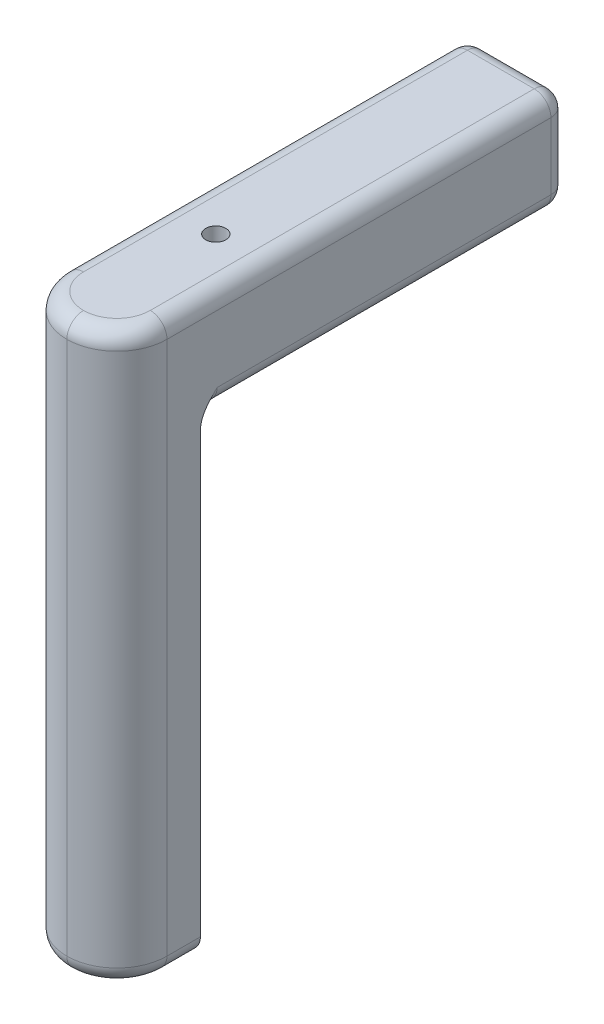
ISO-10303-21;
HEADER;
FILE_DESCRIPTION(('STEP AP214'),'2;1');
FILE_NAME('part.step','',(''),(''),'','','');
FILE_SCHEMA(('AUTOMOTIVE_DESIGN { 1 0 10303 214 1 1 1 1 }'));
ENDSEC;
DATA;
#1=APPLICATION_CONTEXT('core data for automotive mechanical design processes');
#2=APPLICATION_PROTOCOL_DEFINITION('international standard','automotive_design',2000,#1);
#3=PRODUCT_CONTEXT('',#1,'mechanical');
#4=PRODUCT('Part','Part','',(#3));
#5=PRODUCT_RELATED_PRODUCT_CATEGORY('part','',(#4));
#6=PRODUCT_DEFINITION_FORMATION('','',#4);
#7=PRODUCT_DEFINITION_CONTEXT('part definition',#1,'design');
#8=PRODUCT_DEFINITION('design','',#6,#7);
#9=PRODUCT_DEFINITION_SHAPE('','',#8);
#10=(LENGTH_UNIT() NAMED_UNIT(*) SI_UNIT(.MILLI.,.METRE.));
#11=(NAMED_UNIT(*) PLANE_ANGLE_UNIT() SI_UNIT($,.RADIAN.));
#12=(NAMED_UNIT(*) SI_UNIT($,.STERADIAN.) SOLID_ANGLE_UNIT());
#13=UNCERTAINTY_MEASURE_WITH_UNIT(LENGTH_MEASURE(1.E-05),#10,'distance_accuracy_value','');
#14=(GEOMETRIC_REPRESENTATION_CONTEXT(3) GLOBAL_UNCERTAINTY_ASSIGNED_CONTEXT((#13)) GLOBAL_UNIT_ASSIGNED_CONTEXT((#10,
#11,#12)) REPRESENTATION_CONTEXT('',''));
#15=CARTESIAN_POINT('',(0.,0.,0.));
#16=DIRECTION('',(0.,0.,1.));
#17=DIRECTION('',(1.,0.,0.));
#18=AXIS2_PLACEMENT_3D('',#15,#16,#17);
#19=CARTESIAN_POINT('',(30.0000000000001,-330.,240.));
#20=DIRECTION('',(0.,1.,0.));
#21=DIRECTION('',(0.,0.,1.));
#22=AXIS2_PLACEMENT_3D('',#19,#20,#21);
#23=TOROIDAL_SURFACE('',#22,20.,10.);
#24=CARTESIAN_POINT('',(50.0000000000001,-330.,240.));
#25=DIRECTION('',(0.,0.,-1.));
#26=DIRECTION('',(-1.,0.,0.));
#27=AXIS2_PLACEMENT_3D('',#24,#25,#26);
#28=CIRCLE('',#27,10.);
#29=CARTESIAN_POINT('',(60.0000000000001,-330.,240.));
#30=VERTEX_POINT('',#29);
#31=CARTESIAN_POINT('',(50.0000000000001,-340.,240.));
#32=VERTEX_POINT('',#31);
#33=EDGE_CURVE('E11',#30,#32,#28,.T.);
#34=ORIENTED_EDGE('',*,*,#33,.F.);
#35=CARTESIAN_POINT('',(30.0000000000001,-330.,240.));
#36=DIRECTION('',(0.,1.,0.));
#37=DIRECTION('',(0.,0.,1.));
#38=AXIS2_PLACEMENT_3D('',#35,#36,#37);
#39=CIRCLE('',#38,30.);
#40=CARTESIAN_POINT('',(30.0000000000001,-330.,270.));
#41=VERTEX_POINT('',#40);
#42=EDGE_CURVE('E194',#41,#30,#39,.T.);
#43=ORIENTED_EDGE('',*,*,#42,.F.);
#44=CARTESIAN_POINT('',(30.0000000000001,-330.,260.));
#45=DIRECTION('',(1.,0.,0.));
#46=DIRECTION('',(0.,0.,-1.));
#47=AXIS2_PLACEMENT_3D('',#44,#45,#46);
#48=CIRCLE('',#47,10.);
#49=CARTESIAN_POINT('',(30.0000000000001,-340.,260.));
#50=VERTEX_POINT('',#49);
#51=EDGE_CURVE('E43',#41,#50,#48,.T.);
#52=ORIENTED_EDGE('',*,*,#51,.T.);
#53=CARTESIAN_POINT('',(30.0000000000001,-340.,240.));
#54=DIRECTION('',(0.,1.,0.));
#55=DIRECTION('',(0.,0.,1.));
#56=AXIS2_PLACEMENT_3D('',#53,#54,#55);
#57=CIRCLE('',#56,20.);
#58=EDGE_CURVE('E513',#32,#50,#57,.F.);
#59=ORIENTED_EDGE('',*,*,#58,.F.);
#60=EDGE_LOOP('',(#34,#43,#52,#59));
#61=FACE_BOUND('',#60,.T.);
#62=ADVANCED_FACE('F35',(#61),#23,.T.);
#63=CARTESIAN_POINT('',(30.0000000000001,-330.,240.));
#64=DIRECTION('',(0.,1.,0.));
#65=DIRECTION('',(0.,0.,1.));
#66=AXIS2_PLACEMENT_3D('',#63,#64,#65);
#67=TOROIDAL_SURFACE('',#66,20.,10.);
#68=ORIENTED_EDGE('',*,*,#51,.F.);
#69=CARTESIAN_POINT('',(30.0000000000001,-330.,240.));
#70=DIRECTION('',(0.,1.,0.));
#71=DIRECTION('',(0.,0.,1.));
#72=AXIS2_PLACEMENT_3D('',#69,#70,#71);
#73=CIRCLE('',#72,30.);
#74=CARTESIAN_POINT('',(0.,-330.,240.));
#75=VERTEX_POINT('',#74);
#76=EDGE_CURVE('E501',#75,#41,#73,.T.);
#77=ORIENTED_EDGE('',*,*,#76,.F.);
#78=CARTESIAN_POINT('',(10.0000000000001,-330.,240.));
#79=DIRECTION('',(0.,0.,1.));
#80=DIRECTION('',(1.,0.,0.));
#81=AXIS2_PLACEMENT_3D('',#78,#79,#80);
#82=CIRCLE('',#81,10.);
#83=CARTESIAN_POINT('',(10.0000000000001,-340.,240.));
#84=VERTEX_POINT('',#83);
#85=EDGE_CURVE('E511',#75,#84,#82,.T.);
#86=ORIENTED_EDGE('',*,*,#85,.T.);
#87=CARTESIAN_POINT('',(30.0000000000001,-340.,240.));
#88=DIRECTION('',(0.,1.,0.));
#89=DIRECTION('',(0.,0.,1.));
#90=AXIS2_PLACEMENT_3D('',#87,#88,#89);
#91=CIRCLE('',#90,20.);
#92=EDGE_CURVE('E516',#50,#84,#91,.F.);
#93=ORIENTED_EDGE('',*,*,#92,.F.);
#94=EDGE_LOOP('',(#68,#77,#86,#93));
#95=FACE_BOUND('',#94,.T.);
#96=ADVANCED_FACE('F384',(#95),#67,.T.);
#97=CARTESIAN_POINT('',(10.0000000000001,-330.,270.));
#98=DIRECTION('',(0.,0.,1.));
#99=DIRECTION('',(1.,0.,0.));
#100=AXIS2_PLACEMENT_3D('',#97,#98,#99);
#101=CYLINDRICAL_SURFACE('',#100,10.);
#102=ORIENTED_EDGE('',*,*,#85,.F.);
#103=DIRECTION('',(0.,0.,1.));
#104=VECTOR('',#103,1.);
#105=CARTESIAN_POINT('',(0.,-330.,270.));
#106=LINE('',#105,#104);
#107=CARTESIAN_POINT('',(0.,-330.,220.));
#108=VERTEX_POINT('',#107);
#109=EDGE_CURVE('E408',#108,#75,#106,.T.);
#110=ORIENTED_EDGE('',*,*,#109,.F.);
#111=CARTESIAN_POINT('',(10.0000000000001,-330.,220.));
#112=DIRECTION('',(0.,0.,1.));
#113=DIRECTION('',(1.,0.,0.));
#114=AXIS2_PLACEMENT_3D('',#111,#112,#113);
#115=CIRCLE('',#114,10.);
#116=CARTESIAN_POINT('',(10.0000000000001,-340.,220.));
#117=VERTEX_POINT('',#116);
#118=EDGE_CURVE('E503',#117,#108,#115,.F.);
#119=ORIENTED_EDGE('',*,*,#118,.F.);
#120=DIRECTION('',(0.,0.,1.));
#121=VECTOR('',#120,1.);
#122=CARTESIAN_POINT('',(10.0000000000001,-340.,0.));
#123=LINE('',#122,#121);
#124=EDGE_CURVE('E519',#84,#117,#123,.F.);
#125=ORIENTED_EDGE('',*,*,#124,.F.);
#126=EDGE_LOOP('',(#102,#110,#119,#125));
#127=FACE_BOUND('',#126,.T.);
#128=ADVANCED_FACE('F388',(#127),#101,.T.);
#129=CARTESIAN_POINT('',(50.0000000000001,-330.,270.));
#130=DIRECTION('',(0.,0.,-1.));
#131=DIRECTION('',(-1.,0.,0.));
#132=AXIS2_PLACEMENT_3D('',#129,#130,#131);
#133=CYLINDRICAL_SURFACE('',#132,10.);
#134=DIRECTION('',(0.,0.,-1.));
#135=VECTOR('',#134,1.);
#136=CARTESIAN_POINT('',(60.0000000000001,-330.,270.));
#137=LINE('',#136,#135);
#138=CARTESIAN_POINT('',(60.,-330.,220.));
#139=VERTEX_POINT('',#138);
#140=EDGE_CURVE('E478',#30,#139,#137,.T.);
#141=ORIENTED_EDGE('',*,*,#140,.F.);
#142=ORIENTED_EDGE('',*,*,#33,.T.);
#143=DIRECTION('',(0.,0.,-1.));
#144=VECTOR('',#143,1.);
#145=CARTESIAN_POINT('',(50.0000000000001,-340.,0.));
#146=LINE('',#145,#144);
#147=CARTESIAN_POINT('',(50.0000000000001,-340.,220.));
#148=VERTEX_POINT('',#147);
#149=EDGE_CURVE('E522',#148,#32,#146,.F.);
#150=ORIENTED_EDGE('',*,*,#149,.F.);
#151=CARTESIAN_POINT('',(50.0000000000001,-330.,220.));
#152=DIRECTION('',(0.,0.,1.));
#153=DIRECTION('',(1.,0.,0.));
#154=AXIS2_PLACEMENT_3D('',#151,#152,#153);
#155=CIRCLE('',#154,10.);
#156=EDGE_CURVE('E506',#139,#148,#155,.F.);
#157=ORIENTED_EDGE('',*,*,#156,.F.);
#158=EDGE_LOOP('',(#141,#142,#150,#157));
#159=FACE_BOUND('',#158,.T.);
#160=ADVANCED_FACE('F37',(#159),#133,.T.);
#161=CARTESIAN_POINT('',(60.,-70.,210.));
#162=DIRECTION('',(-1.,0.,0.));
#163=DIRECTION('',(0.,-1.,0.));
#164=AXIS2_PLACEMENT_3D('',#161,#162,#163);
#165=CYLINDRICAL_SURFACE('',#164,10.);
#166=CARTESIAN_POINT('',(50.,-70.,210.));
#167=DIRECTION('',(-1.,0.,0.));
#168=DIRECTION('',(0.,0.,1.));
#169=AXIS2_PLACEMENT_3D('',#166,#167,#168);
#170=CIRCLE('',#169,10.);
#171=CARTESIAN_POINT('',(50.,-70.,220.));
#172=VERTEX_POINT('',#171);
#173=CARTESIAN_POINT('',(50.,-60.,210.));
#174=VERTEX_POINT('',#173);
#175=EDGE_CURVE('E409',#172,#174,#170,.T.);
#176=ORIENTED_EDGE('',*,*,#175,.F.);
#177=DIRECTION('',(1.,0.,0.));
#178=VECTOR('',#177,1.);
#179=CARTESIAN_POINT('',(60.,-70.,220.));
#180=LINE('',#179,#178);
#181=CARTESIAN_POINT('',(10.,-70.,220.));
#182=VERTEX_POINT('',#181);
#183=EDGE_CURVE('E286',#182,#172,#180,.T.);
#184=ORIENTED_EDGE('',*,*,#183,.F.);
#185=CARTESIAN_POINT('',(10.,-70.,210.));
#186=DIRECTION('',(-1.,0.,0.));
#187=DIRECTION('',(0.,-1.,0.));
#188=AXIS2_PLACEMENT_3D('',#185,#186,#187);
#189=CIRCLE('',#188,10.);
#190=CARTESIAN_POINT('',(10.,-60.,210.));
#191=VERTEX_POINT('',#190);
#192=EDGE_CURVE('E309',#182,#191,#189,.T.);
#193=ORIENTED_EDGE('',*,*,#192,.T.);
#194=DIRECTION('',(1.,0.,0.));
#195=VECTOR('',#194,1.);
#196=CARTESIAN_POINT('',(60.,-60.,210.));
#197=LINE('',#196,#195);
#198=EDGE_CURVE('E295',#174,#191,#197,.F.);
#199=ORIENTED_EDGE('',*,*,#198,.F.);
#200=EDGE_LOOP('',(#176,#184,#193,#199));
#201=FACE_BOUND('',#200,.T.);
#202=ADVANCED_FACE('F394',(#201),#165,.F.);
#203=CARTESIAN_POINT('',(10.,-50.,210.));
#204=DIRECTION('',(0.,0.,1.));
#205=DIRECTION('',(1.,0.,0.));
#206=AXIS2_PLACEMENT_3D('',#203,#204,#205);
#207=TOROIDAL_SURFACE('',#206,20.,10.);
#208=ORIENTED_EDGE('',*,*,#192,.F.);
#209=CARTESIAN_POINT('',(10.,-50.,220.));
#210=DIRECTION('',(0.,0.,1.));
#211=DIRECTION('',(1.,0.,0.));
#212=AXIS2_PLACEMENT_3D('',#209,#210,#211);
#213=CIRCLE('',#212,20.);
#214=CARTESIAN_POINT('',(0.,-67.3205080756888,220.));
#215=VERTEX_POINT('',#214);
#216=EDGE_CURVE('E289',#215,#182,#213,.T.);
#217=ORIENTED_EDGE('',*,*,#216,.F.);
#218=CARTESIAN_POINT('',(0.,-67.3205080756888,220.));
#219=CARTESIAN_POINT('',(0.,-67.1062907853983,220.000000829417));
#220=CARTESIAN_POINT('',(0.,-66.8921147964453,219.994836871748));
#221=CARTESIAN_POINT('',(0.,-66.4642751543601,219.974491501273));
#222=CARTESIAN_POINT('',(0.,-66.2506114166656,219.959311875246));
#223=CARTESIAN_POINT('',(0.,-65.6116455019268,219.899282982085));
#224=CARTESIAN_POINT('',(0.,-65.1876354946503,219.839941524498));
#225=CARTESIAN_POINT('',(0.,-64.3514038896006,219.686351182212));
#226=CARTESIAN_POINT('',(0.,-63.9391018127161,219.592531458086));
#227=CARTESIAN_POINT('',(0.,-63.1229969058086,219.372806541135));
#228=CARTESIAN_POINT('',(0.,-62.7191982356669,219.246886021966));
#229=CARTESIAN_POINT('',(0.,-61.7735269645086,218.913718731248));
#230=CARTESIAN_POINT('',(0.,-61.2361612650731,218.69364330392));
#231=CARTESIAN_POINT('',(0.,-60.1831990768957,218.206627544239));
#232=CARTESIAN_POINT('',(0.,-59.6676092455983,217.939673006562));
#233=CARTESIAN_POINT('',(0.,-58.6564886785677,217.365152113458));
#234=CARTESIAN_POINT('',(0.,-58.1610654952248,217.057397901332));
#235=CARTESIAN_POINT('',(0.,-57.1918276771039,216.409375692374));
#236=CARTESIAN_POINT('',(0.,-56.7180230662366,216.069092834784));
#237=CARTESIAN_POINT('',(0.,-55.6929197676459,215.288802211421));
#238=CARTESIAN_POINT('',(0.,-55.1461840200336,214.842838078763));
#239=CARTESIAN_POINT('',(0.,-54.0758369196157,213.92383304621));
#240=CARTESIAN_POINT('',(0.,-53.5522359254217,213.450780230682));
#241=CARTESIAN_POINT('',(0.,-52.0073282129812,212.00699997596));
#242=CARTESIAN_POINT('',(0.,-51.0104804173162,211.010478873278));
#243=CARTESIAN_POINT('',(0.,-50.0094280824946,210.009428082719));
#244=CARTESIAN_POINT('',(0.,-50.0047140372459,210.004714037463));
#245=CARTESIAN_POINT('',(0.,-50.,210.));
#246=B_SPLINE_CURVE_WITH_KNOTS('',3,(#218,#219,#220,#221,#222,#223,#224,#225,#226,#227,#228,
#229,#230,#231,#232,#233,#234,#235,#236,#237,#238,#239,#240,#241,#242,#243,#244,#245),
.UNSPECIFIED.,.F.,.F.,(4,2,2,2,2,2,2,2,2,2,2,2,2,4),(0.,0.642515246720243,1.28491590083639,
2.56752628259208,3.83468440193273,5.10244865556355,6.84175192857022,8.58158315814063,
10.329723087327,12.0786655086561,14.1940481607873,16.3103685733023,20.5374636264517,
20.557463626454),.UNSPECIFIED.);
#247=CARTESIAN_POINT('',(0.,-50.,210.));
#248=VERTEX_POINT('',#247);
#249=EDGE_CURVE('E301',#215,#248,#246,.T.);
#250=ORIENTED_EDGE('',*,*,#249,.T.);
#251=CARTESIAN_POINT('',(10.,-50.,210.));
#252=DIRECTION('',(0.,0.,1.));
#253=DIRECTION('',(1.,0.,0.));
#254=AXIS2_PLACEMENT_3D('',#251,#252,#253);
#255=CIRCLE('',#254,10.);
#256=EDGE_CURVE('E292',#191,#248,#255,.F.);
#257=ORIENTED_EDGE('',*,*,#256,.F.);
#258=EDGE_LOOP('',(#208,#217,#250,#257));
#259=FACE_BOUND('',#258,.T.);
#260=ADVANCED_FACE('F311',(#259),#207,.F.);
#261=CARTESIAN_POINT('',(50.,-50.,210.));
#262=DIRECTION('',(0.,0.,1.));
#263=DIRECTION('',(1.,0.,0.));
#264=AXIS2_PLACEMENT_3D('',#261,#262,#263);
#265=TOROIDAL_SURFACE('',#264,20.,10.);
#266=CARTESIAN_POINT('',(50.,-50.,220.));
#267=DIRECTION('',(0.,0.,1.));
#268=DIRECTION('',(1.,0.,0.));
#269=AXIS2_PLACEMENT_3D('',#266,#267,#268);
#270=CIRCLE('',#269,20.);
#271=CARTESIAN_POINT('',(60.,-67.3205080756888,220.));
#272=VERTEX_POINT('',#271);
#273=EDGE_CURVE('E283',#172,#272,#270,.T.);
#274=ORIENTED_EDGE('',*,*,#273,.F.);
#275=ORIENTED_EDGE('',*,*,#175,.T.);
#276=CARTESIAN_POINT('',(50.,-50.,210.));
#277=DIRECTION('',(0.,0.,1.));
#278=DIRECTION('',(1.,0.,0.));
#279=AXIS2_PLACEMENT_3D('',#276,#277,#278);
#280=CIRCLE('',#279,10.);
#281=CARTESIAN_POINT('',(60.,-50.,210.));
#282=VERTEX_POINT('',#281);
#283=EDGE_CURVE('E298',#282,#174,#280,.F.);
#284=ORIENTED_EDGE('',*,*,#283,.F.);
#285=CARTESIAN_POINT('',(60.,-67.3205080756888,220.));
#286=CARTESIAN_POINT('',(60.,-67.1062907853998,220.000000829417));
#287=CARTESIAN_POINT('',(60.,-66.8921147964481,219.994836871748));
#288=CARTESIAN_POINT('',(60.,-66.4642751543657,219.974491501273));
#289=CARTESIAN_POINT('',(60.,-66.2506114166725,219.959311875247));
#290=CARTESIAN_POINT('',(60.,-65.6116455019379,219.899282982087));
#291=CARTESIAN_POINT('',(60.,-65.1876354946642,219.8399415245));
#292=CARTESIAN_POINT('',(60.,-64.3514038896144,219.686351182215));
#293=CARTESIAN_POINT('',(60.,-63.9391018127272,219.592531458089));
#294=CARTESIAN_POINT('',(60.,-63.1229969058141,219.372806541136));
#295=CARTESIAN_POINT('',(60.,-62.7191982356696,219.246886021966));
#296=CARTESIAN_POINT('',(60.,-61.7735269645064,218.913718731247));
#297=CARTESIAN_POINT('',(60.,-61.2361612650687,218.693643303918));
#298=CARTESIAN_POINT('',(60.,-60.1831990768874,218.206627544235));
#299=CARTESIAN_POINT('',(60.,-59.6676092455883,217.939673006557));
#300=CARTESIAN_POINT('',(60.,-58.6564886785586,217.365152113452));
#301=CARTESIAN_POINT('',(60.,-58.1610654952181,217.057397901328));
#302=CARTESIAN_POINT('',(60.,-57.1918276771007,216.409375692372));
#303=CARTESIAN_POINT('',(60.,-56.7180230662344,216.069092834784));
#304=CARTESIAN_POINT('',(60.,-55.6929197676474,215.288802211421));
#305=CARTESIAN_POINT('',(60.,-55.1461840200384,214.84283807876));
#306=CARTESIAN_POINT('',(60.,-54.0758369196146,213.923833046217));
#307=CARTESIAN_POINT('',(60.,-53.5522359254112,213.450780230701));
#308=CARTESIAN_POINT('',(60.,-52.0073282130139,212.006999975934));
#309=CARTESIAN_POINT('',(60.,-51.0104804174776,211.01047887312));
#310=CARTESIAN_POINT('',(60.,-50.0094280824961,210.009428082717));
#311=CARTESIAN_POINT('',(60.,-50.0047140372466,210.004714037462));
#312=CARTESIAN_POINT('',(60.,-50.,210.));
#313=B_SPLINE_CURVE_WITH_KNOTS('',3,(#285,#286,#287,#288,#289,#290,#291,#292,#293,#294,#295,
#296,#297,#298,#299,#300,#301,#302,#303,#304,#305,#306,#307,#308,#309,#310,#311,#312),
.UNSPECIFIED.,.F.,.F.,(4,2,2,2,2,2,2,2,2,2,2,2,2,4),(0.,0.64251524671609,1.28491590082808,
2.56752628257515,3.83468440192409,5.10244865556354,6.8417519285774,8.58158315815393,
10.3297230873326,12.0786655086561,14.1940481607855,16.310368573295,20.5374636264518,
20.557463626454),.UNSPECIFIED.);
#314=EDGE_CURVE('E401',#282,#272,#313,.F.);
#315=ORIENTED_EDGE('',*,*,#314,.T.);
#316=EDGE_LOOP('',(#274,#275,#284,#315));
#317=FACE_BOUND('',#316,.T.);
#318=ADVANCED_FACE('F376',(#317),#265,.F.);
#319=CARTESIAN_POINT('',(10.,-50.,10.));
#320=DIRECTION('',(0.,1.,0.));
#321=DIRECTION('',(-1.,0.,0.));
#322=AXIS2_PLACEMENT_3D('',#319,#320,#321);
#323=SPHERICAL_SURFACE('',#322,10.);
#324=CARTESIAN_POINT('',(10.,-50.,10.));
#325=DIRECTION('',(0.,0.,1.));
#326=DIRECTION('',(1.,0.,0.));
#327=AXIS2_PLACEMENT_3D('',#324,#325,#326);
#328=CIRCLE('',#327,10.);
#329=CARTESIAN_POINT('',(0.,-50.,10.));
#330=VERTEX_POINT('',#329);
#331=CARTESIAN_POINT('',(10.,-60.,10.));
#332=VERTEX_POINT('',#331);
#333=EDGE_CURVE('E280',#330,#332,#328,.T.);
#334=ORIENTED_EDGE('',*,*,#333,.F.);
#335=CARTESIAN_POINT('',(10.,-50.,10.));
#336=DIRECTION('',(0.,1.,0.));
#337=DIRECTION('',(-1.,0.,0.));
#338=AXIS2_PLACEMENT_3D('',#335,#336,#337);
#339=CIRCLE('',#338,10.);
#340=CARTESIAN_POINT('',(10.,-50.,0.));
#341=VERTEX_POINT('',#340);
#342=EDGE_CURVE('E266',#341,#330,#339,.T.);
#343=ORIENTED_EDGE('',*,*,#342,.F.);
#344=CARTESIAN_POINT('',(10.,-50.,10.));
#345=DIRECTION('',(-1.,0.,0.));
#346=DIRECTION('',(0.,-1.,0.));
#347=AXIS2_PLACEMENT_3D('',#344,#345,#346);
#348=CIRCLE('',#347,10.);
#349=EDGE_CURVE('E277',#341,#332,#348,.T.);
#350=ORIENTED_EDGE('',*,*,#349,.T.);
#351=EDGE_LOOP('',(#334,#343,#350));
#352=FACE_BOUND('',#351,.T.);
#353=ADVANCED_FACE('F373',(#352),#323,.T.);
#354=CARTESIAN_POINT('',(0.,-50.,10.));
#355=DIRECTION('',(1.,0.,0.));
#356=DIRECTION('',(0.,1.,0.));
#357=AXIS2_PLACEMENT_3D('',#354,#355,#356);
#358=CYLINDRICAL_SURFACE('',#357,10.);
#359=ORIENTED_EDGE('',*,*,#349,.F.);
#360=DIRECTION('',(-1.,0.,0.));
#361=VECTOR('',#360,1.);
#362=CARTESIAN_POINT('',(0.,-50.,0.));
#363=LINE('',#362,#361);
#364=CARTESIAN_POINT('',(50.,-50.,0.));
#365=VERTEX_POINT('',#364);
#366=EDGE_CURVE('E263',#365,#341,#363,.T.);
#367=ORIENTED_EDGE('',*,*,#366,.F.);
#368=CARTESIAN_POINT('',(50.,-50.,10.));
#369=DIRECTION('',(-1.,0.,0.));
#370=DIRECTION('',(0.,0.,1.));
#371=AXIS2_PLACEMENT_3D('',#368,#369,#370);
#372=CIRCLE('',#371,10.);
#373=CARTESIAN_POINT('',(50.,-60.,10.));
#374=VERTEX_POINT('',#373);
#375=EDGE_CURVE('E275',#365,#374,#372,.T.);
#376=ORIENTED_EDGE('',*,*,#375,.T.);
#377=DIRECTION('',(-1.,0.,0.));
#378=VECTOR('',#377,1.);
#379=CARTESIAN_POINT('',(0.,-60.,10.));
#380=LINE('',#379,#378);
#381=EDGE_CURVE('E254',#332,#374,#380,.F.);
#382=ORIENTED_EDGE('',*,*,#381,.F.);
#383=EDGE_LOOP('',(#359,#367,#376,#382));
#384=FACE_BOUND('',#383,.T.);
#385=ADVANCED_FACE('F369',(#384),#358,.T.);
#386=CARTESIAN_POINT('',(50.,-50.,10.));
#387=DIRECTION('',(0.,1.,0.));
#388=DIRECTION('',(-1.,0.,0.));
#389=AXIS2_PLACEMENT_3D('',#386,#387,#388);
#390=SPHERICAL_SURFACE('',#389,10.);
#391=ORIENTED_EDGE('',*,*,#375,.F.);
#392=CARTESIAN_POINT('',(50.,-50.,10.));
#393=DIRECTION('',(0.,-1.,0.));
#394=DIRECTION('',(1.,0.,0.));
#395=AXIS2_PLACEMENT_3D('',#392,#393,#394);
#396=CIRCLE('',#395,10.);
#397=CARTESIAN_POINT('',(60.,-50.,10.));
#398=VERTEX_POINT('',#397);
#399=EDGE_CURVE('E260',#398,#365,#396,.F.);
#400=ORIENTED_EDGE('',*,*,#399,.F.);
#401=CARTESIAN_POINT('',(50.,-50.,10.));
#402=DIRECTION('',(0.,0.,-1.));
#403=DIRECTION('',(-1.,0.,0.));
#404=AXIS2_PLACEMENT_3D('',#401,#402,#403);
#405=CIRCLE('',#404,10.);
#406=EDGE_CURVE('E272',#398,#374,#405,.T.);
#407=ORIENTED_EDGE('',*,*,#406,.T.);
#408=EDGE_LOOP('',(#391,#400,#407));
#409=FACE_BOUND('',#408,.T.);
#410=ADVANCED_FACE('F365',(#409),#390,.T.);
#411=CARTESIAN_POINT('',(50.,-50.,270.));
#412=DIRECTION('',(0.,0.,-1.));
#413=DIRECTION('',(-1.,0.,0.));
#414=AXIS2_PLACEMENT_3D('',#411,#412,#413);
#415=CYLINDRICAL_SURFACE('',#414,10.);
#416=DIRECTION('',(0.,0.,-1.));
#417=VECTOR('',#416,1.);
#418=CARTESIAN_POINT('',(60.,-50.,270.));
#419=LINE('',#418,#417);
#420=EDGE_CURVE('E250',#282,#398,#419,.T.);
#421=ORIENTED_EDGE('',*,*,#420,.F.);
#422=ORIENTED_EDGE('',*,*,#283,.T.);
#423=DIRECTION('',(0.,0.,-1.));
#424=VECTOR('',#423,1.);
#425=CARTESIAN_POINT('',(50.,-60.,270.));
#426=LINE('',#425,#424);
#427=EDGE_CURVE('E257',#374,#174,#426,.F.);
#428=ORIENTED_EDGE('',*,*,#427,.F.);
#429=ORIENTED_EDGE('',*,*,#406,.F.);
#430=EDGE_LOOP('',(#421,#422,#428,#429));
#431=FACE_BOUND('',#430,.T.);
#432=ADVANCED_FACE('F362',(#431),#415,.T.);
#433=CARTESIAN_POINT('',(10.,-50.,270.));
#434=DIRECTION('',(0.,0.,1.));
#435=DIRECTION('',(1.,0.,0.));
#436=AXIS2_PLACEMENT_3D('',#433,#434,#435);
#437=CYLINDRICAL_SURFACE('',#436,10.);
#438=DIRECTION('',(0.,0.,1.));
#439=VECTOR('',#438,1.);
#440=CARTESIAN_POINT('',(10.,-60.,270.));
#441=LINE('',#440,#439);
#442=EDGE_CURVE('E252',#191,#332,#441,.F.);
#443=ORIENTED_EDGE('',*,*,#442,.F.);
#444=ORIENTED_EDGE('',*,*,#256,.T.);
#445=DIRECTION('',(0.,0.,1.));
#446=VECTOR('',#445,1.);
#447=CARTESIAN_POINT('',(0.,-50.,270.));
#448=LINE('',#447,#446);
#449=EDGE_CURVE('E269',#330,#248,#448,.T.);
#450=ORIENTED_EDGE('',*,*,#449,.F.);
#451=ORIENTED_EDGE('',*,*,#333,.T.);
#452=EDGE_LOOP('',(#443,#444,#450,#451));
#453=FACE_BOUND('',#452,.T.);
#454=ADVANCED_FACE('F357',(#453),#437,.T.);
#455=CARTESIAN_POINT('',(10.,-9.99999999999999,10.));
#456=DIRECTION('',(0.,0.,-1.));
#457=DIRECTION('',(-1.,0.,0.));
#458=AXIS2_PLACEMENT_3D('',#455,#456,#457);
#459=SPHERICAL_SURFACE('',#458,10.);
#460=CARTESIAN_POINT('',(10.,-9.99999999999999,9.99999999999995));
#461=DIRECTION('',(0.,-1.,0.));
#462=DIRECTION('',(0.,0.,-1.));
#463=AXIS2_PLACEMENT_3D('',#460,#461,#462);
#464=CIRCLE('',#463,10.);
#465=CARTESIAN_POINT('',(0.,-9.99999999999999,9.99999999999995));
#466=VERTEX_POINT('',#465);
#467=CARTESIAN_POINT('',(10.,-9.99999999999999,0.));
#468=VERTEX_POINT('',#467);
#469=EDGE_CURVE('E247',#466,#468,#464,.T.);
#470=ORIENTED_EDGE('',*,*,#469,.F.);
#471=CARTESIAN_POINT('',(10.,-9.99999999999999,10.));
#472=DIRECTION('',(0.,0.,-1.));
#473=DIRECTION('',(-1.,0.,0.));
#474=AXIS2_PLACEMENT_3D('',#471,#472,#473);
#475=CIRCLE('',#474,10.);
#476=CARTESIAN_POINT('',(10.,0.,9.99999999999995));
#477=VERTEX_POINT('',#476);
#478=EDGE_CURVE('E233',#477,#466,#475,.F.);
#479=ORIENTED_EDGE('',*,*,#478,.F.);
#480=CARTESIAN_POINT('',(10.,-10.,9.99999999999995));
#481=DIRECTION('',(-1.,0.,0.));
#482=DIRECTION('',(0.,0.,1.));
#483=AXIS2_PLACEMENT_3D('',#480,#481,#482);
#484=CIRCLE('',#483,10.);
#485=EDGE_CURVE('E244',#477,#468,#484,.T.);
#486=ORIENTED_EDGE('',*,*,#485,.T.);
#487=EDGE_LOOP('',(#470,#479,#486));
#488=FACE_BOUND('',#487,.T.);
#489=ADVANCED_FACE('F353',(#488),#459,.T.);
#490=CARTESIAN_POINT('',(0.,-10.,10.));
#491=DIRECTION('',(1.,0.,0.));
#492=DIRECTION('',(0.,0.,-1.));
#493=AXIS2_PLACEMENT_3D('',#490,#491,#492);
#494=CYLINDRICAL_SURFACE('',#493,10.);
#495=ORIENTED_EDGE('',*,*,#485,.F.);
#496=DIRECTION('',(-1.,0.,0.));
#497=VECTOR('',#496,1.);
#498=CARTESIAN_POINT('',(0.,0.,10.));
#499=LINE('',#498,#497);
#500=CARTESIAN_POINT('',(50.,0.,10.));
#501=VERTEX_POINT('',#500);
#502=EDGE_CURVE('E230',#501,#477,#499,.T.);
#503=ORIENTED_EDGE('',*,*,#502,.F.);
#504=CARTESIAN_POINT('',(50.,-10.,10.));
#505=DIRECTION('',(-1.,0.,0.));
#506=DIRECTION('',(0.,0.,1.));
#507=AXIS2_PLACEMENT_3D('',#504,#505,#506);
#508=CIRCLE('',#507,10.);
#509=CARTESIAN_POINT('',(50.,-10.,0.));
#510=VERTEX_POINT('',#509);
#511=EDGE_CURVE('E242',#501,#510,#508,.T.);
#512=ORIENTED_EDGE('',*,*,#511,.T.);
#513=DIRECTION('',(-1.,0.,0.));
#514=VECTOR('',#513,1.);
#515=CARTESIAN_POINT('',(0.,-10.,0.));
#516=LINE('',#515,#514);
#517=EDGE_CURVE('E222',#468,#510,#516,.F.);
#518=ORIENTED_EDGE('',*,*,#517,.F.);
#519=EDGE_LOOP('',(#495,#503,#512,#518));
#520=FACE_BOUND('',#519,.T.);
#521=ADVANCED_FACE('F349',(#520),#494,.T.);
#522=CARTESIAN_POINT('',(50.,-10.,10.));
#523=DIRECTION('',(0.,0.,-1.));
#524=DIRECTION('',(-1.,0.,0.));
#525=AXIS2_PLACEMENT_3D('',#522,#523,#524);
#526=SPHERICAL_SURFACE('',#525,10.);
#527=ORIENTED_EDGE('',*,*,#511,.F.);
#528=CARTESIAN_POINT('',(50.,-10.,10.));
#529=DIRECTION('',(0.,0.,1.));
#530=DIRECTION('',(1.,0.,0.));
#531=AXIS2_PLACEMENT_3D('',#528,#529,#530);
#532=CIRCLE('',#531,10.);
#533=CARTESIAN_POINT('',(60.,-9.99999999999999,10.));
#534=VERTEX_POINT('',#533);
#535=EDGE_CURVE('E228',#534,#501,#532,.T.);
#536=ORIENTED_EDGE('',*,*,#535,.F.);
#537=CARTESIAN_POINT('',(50.,-10.,10.));
#538=DIRECTION('',(0.,1.,0.));
#539=DIRECTION('',(-1.,0.,0.));
#540=AXIS2_PLACEMENT_3D('',#537,#538,#539);
#541=CIRCLE('',#540,10.);
#542=EDGE_CURVE('E239',#534,#510,#541,.T.);
#543=ORIENTED_EDGE('',*,*,#542,.T.);
#544=EDGE_LOOP('',(#527,#536,#543));
#545=FACE_BOUND('',#544,.T.);
#546=ADVANCED_FACE('F345',(#545),#526,.T.);
#547=CARTESIAN_POINT('',(50.,0.,10.));
#548=DIRECTION('',(0.,-1.,0.));
#549=DIRECTION('',(1.,0.,0.));
#550=AXIS2_PLACEMENT_3D('',#547,#548,#549);
#551=CYLINDRICAL_SURFACE('',#550,10.);
#552=DIRECTION('',(0.,1.,0.));
#553=VECTOR('',#552,1.);
#554=CARTESIAN_POINT('',(60.,0.,10.));
#555=LINE('',#554,#553);
#556=EDGE_CURVE('E164',#398,#534,#555,.T.);
#557=ORIENTED_EDGE('',*,*,#556,.F.);
#558=ORIENTED_EDGE('',*,*,#399,.T.);
#559=DIRECTION('',(0.,1.,0.));
#560=VECTOR('',#559,1.);
#561=CARTESIAN_POINT('',(50.,0.,0.));
#562=LINE('',#561,#560);
#563=EDGE_CURVE('E225',#510,#365,#562,.F.);
#564=ORIENTED_EDGE('',*,*,#563,.F.);
#565=ORIENTED_EDGE('',*,*,#542,.F.);
#566=EDGE_LOOP('',(#557,#558,#564,#565));
#567=FACE_BOUND('',#566,.T.);
#568=ADVANCED_FACE('F342',(#567),#551,.T.);
#569=CARTESIAN_POINT('',(10.,-60.,10.));
#570=DIRECTION('',(0.,1.,0.));
#571=DIRECTION('',(-1.,0.,0.));
#572=AXIS2_PLACEMENT_3D('',#569,#570,#571);
#573=CYLINDRICAL_SURFACE('',#572,10.);
#574=DIRECTION('',(0.,-1.,0.));
#575=VECTOR('',#574,1.);
#576=CARTESIAN_POINT('',(10.,-60.,0.));
#577=LINE('',#576,#575);
#578=EDGE_CURVE('E220',#341,#468,#577,.F.);
#579=ORIENTED_EDGE('',*,*,#578,.F.);
#580=ORIENTED_EDGE('',*,*,#342,.T.);
#581=DIRECTION('',(0.,-1.,0.));
#582=VECTOR('',#581,1.);
#583=CARTESIAN_POINT('',(0.,-60.,10.));
#584=LINE('',#583,#582);
#585=EDGE_CURVE('E236',#466,#330,#584,.T.);
#586=ORIENTED_EDGE('',*,*,#585,.F.);
#587=ORIENTED_EDGE('',*,*,#469,.T.);
#588=EDGE_LOOP('',(#579,#580,#586,#587));
#589=FACE_BOUND('',#588,.T.);
#590=ADVANCED_FACE('F337',(#589),#573,.T.);
#591=CARTESIAN_POINT('',(30.,-10.,240.));
#592=DIRECTION('',(0.,-1.,0.));
#593=DIRECTION('',(0.,0.,-1.));
#594=AXIS2_PLACEMENT_3D('',#591,#592,#593);
#595=TOROIDAL_SURFACE('',#594,20.,10.);
#596=CARTESIAN_POINT('',(10.,-10.,240.));
#597=DIRECTION('',(0.,0.,-1.));
#598=DIRECTION('',(-1.,0.,0.));
#599=AXIS2_PLACEMENT_3D('',#596,#597,#598);
#600=CIRCLE('',#599,10.);
#601=CARTESIAN_POINT('',(0.,-10.,240.));
#602=VERTEX_POINT('',#601);
#603=CARTESIAN_POINT('',(10.,0.,240.));
#604=VERTEX_POINT('',#603);
#605=EDGE_CURVE('E216',#602,#604,#600,.T.);
#606=ORIENTED_EDGE('',*,*,#605,.F.);
#607=CARTESIAN_POINT('',(30.,-10.,240.));
#608=DIRECTION('',(0.,-1.,0.));
#609=DIRECTION('',(0.,0.,-1.));
#610=AXIS2_PLACEMENT_3D('',#607,#608,#609);
#611=CIRCLE('',#610,30.);
#612=CARTESIAN_POINT('',(30.,-10.,270.));
#613=VERTEX_POINT('',#612);
#614=EDGE_CURVE('E190',#613,#602,#611,.T.);
#615=ORIENTED_EDGE('',*,*,#614,.F.);
#616=CARTESIAN_POINT('',(30.,-10.,260.));
#617=DIRECTION('',(-1.,0.,0.));
#618=DIRECTION('',(0.,0.,1.));
#619=AXIS2_PLACEMENT_3D('',#616,#617,#618);
#620=CIRCLE('',#619,10.);
#621=CARTESIAN_POINT('',(30.,0.,260.));
#622=VERTEX_POINT('',#621);
#623=EDGE_CURVE('E180',#613,#622,#620,.T.);
#624=ORIENTED_EDGE('',*,*,#623,.T.);
#625=CARTESIAN_POINT('',(30.,0.,240.));
#626=DIRECTION('',(0.,-1.,0.));
#627=DIRECTION('',(0.,0.,-1.));
#628=AXIS2_PLACEMENT_3D('',#625,#626,#627);
#629=CIRCLE('',#628,20.);
#630=EDGE_CURVE('E205',#604,#622,#629,.F.);
#631=ORIENTED_EDGE('',*,*,#630,.F.);
#632=EDGE_LOOP('',(#606,#615,#624,#631));
#633=FACE_BOUND('',#632,.T.);
#634=ADVANCED_FACE('F334',(#633),#595,.T.);
#635=CARTESIAN_POINT('',(30.,-10.,240.));
#636=DIRECTION('',(0.,-1.,0.));
#637=DIRECTION('',(0.,0.,-1.));
#638=AXIS2_PLACEMENT_3D('',#635,#636,#637);
#639=TOROIDAL_SURFACE('',#638,20.,10.);
#640=ORIENTED_EDGE('',*,*,#623,.F.);
#641=CARTESIAN_POINT('',(30.,-10.,240.));
#642=DIRECTION('',(0.,-1.,0.));
#643=DIRECTION('',(0.,0.,-1.));
#644=AXIS2_PLACEMENT_3D('',#641,#642,#643);
#645=CIRCLE('',#644,30.);
#646=CARTESIAN_POINT('',(60.,-9.99999999999999,240.));
#647=VERTEX_POINT('',#646);
#648=EDGE_CURVE('E185',#647,#613,#645,.T.);
#649=ORIENTED_EDGE('',*,*,#648,.F.);
#650=CARTESIAN_POINT('',(50.,-10.,240.));
#651=DIRECTION('',(0.,0.,1.));
#652=DIRECTION('',(1.,0.,0.));
#653=AXIS2_PLACEMENT_3D('',#650,#651,#652);
#654=CIRCLE('',#653,10.);
#655=CARTESIAN_POINT('',(50.,0.,240.));
#656=VERTEX_POINT('',#655);
#657=EDGE_CURVE('E172',#647,#656,#654,.T.);
#658=ORIENTED_EDGE('',*,*,#657,.T.);
#659=CARTESIAN_POINT('',(30.,0.,240.));
#660=DIRECTION('',(0.,-1.,0.));
#661=DIRECTION('',(0.,0.,-1.));
#662=AXIS2_PLACEMENT_3D('',#659,#660,#661);
#663=CIRCLE('',#662,20.);
#664=EDGE_CURVE('E208',#622,#656,#663,.F.);
#665=ORIENTED_EDGE('',*,*,#664,.F.);
#666=EDGE_LOOP('',(#640,#649,#658,#665));
#667=FACE_BOUND('',#666,.T.);
#668=ADVANCED_FACE('F186',(#667),#639,.T.);
#669=CARTESIAN_POINT('',(50.,-10.,270.));
#670=DIRECTION('',(0.,0.,1.));
#671=DIRECTION('',(1.,0.,0.));
#672=AXIS2_PLACEMENT_3D('',#669,#670,#671);
#673=CYLINDRICAL_SURFACE('',#672,10.);
#674=DIRECTION('',(0.,0.,1.));
#675=VECTOR('',#674,1.);
#676=CARTESIAN_POINT('',(60.,-9.99999999999999,270.));
#677=LINE('',#676,#675);
#678=EDGE_CURVE('E158',#534,#647,#677,.T.);
#679=ORIENTED_EDGE('',*,*,#678,.F.);
#680=ORIENTED_EDGE('',*,*,#535,.T.);
#681=DIRECTION('',(0.,0.,1.));
#682=VECTOR('',#681,1.);
#683=CARTESIAN_POINT('',(50.,0.,270.));
#684=LINE('',#683,#682);
#685=EDGE_CURVE('E176',#656,#501,#684,.F.);
#686=ORIENTED_EDGE('',*,*,#685,.F.);
#687=ORIENTED_EDGE('',*,*,#657,.F.);
#688=EDGE_LOOP('',(#679,#680,#686,#687));
#689=FACE_BOUND('',#688,.T.);
#690=ADVANCED_FACE('F174',(#689),#673,.T.);
#691=CARTESIAN_POINT('',(10.,-9.99999999999999,270.));
#692=DIRECTION('',(0.,0.,-1.));
#693=DIRECTION('',(-1.,0.,0.));
#694=AXIS2_PLACEMENT_3D('',#691,#692,#693);
#695=CYLINDRICAL_SURFACE('',#694,10.);
#696=DIRECTION('',(0.,0.,-1.));
#697=VECTOR('',#696,1.);
#698=CARTESIAN_POINT('',(10.,0.,270.));
#699=LINE('',#698,#697);
#700=EDGE_CURVE('E168',#477,#604,#699,.F.);
#701=ORIENTED_EDGE('',*,*,#700,.F.);
#702=ORIENTED_EDGE('',*,*,#478,.T.);
#703=DIRECTION('',(0.,0.,-1.));
#704=VECTOR('',#703,1.);
#705=CARTESIAN_POINT('',(0.,-9.99999999999999,270.));
#706=LINE('',#705,#704);
#707=EDGE_CURVE('E181',#602,#466,#706,.T.);
#708=ORIENTED_EDGE('',*,*,#707,.F.);
#709=ORIENTED_EDGE('',*,*,#605,.T.);
#710=EDGE_LOOP('',(#701,#702,#708,#709));
#711=FACE_BOUND('',#710,.T.);
#712=ADVANCED_FACE('F328',(#711),#695,.T.);
#713=CARTESIAN_POINT('',(30.,0.,240.));
#714=DIRECTION('',(0.,-1.,0.));
#715=DIRECTION('',(1.,0.,0.));
#716=AXIS2_PLACEMENT_3D('',#713,#714,#715);
#717=CYLINDRICAL_SURFACE('',#716,30.);
#718=DIRECTION('',(0.,-1.,0.));
#719=VECTOR('',#718,1.);
#720=CARTESIAN_POINT('',(0.,-60.,240.));
#721=LINE('',#720,#719);
#722=EDGE_CURVE('E169',#75,#602,#721,.F.);
#723=ORIENTED_EDGE('',*,*,#722,.F.);
#724=ORIENTED_EDGE('',*,*,#76,.T.);
#725=DIRECTION('',(0.,-1.,0.));
#726=VECTOR('',#725,1.);
#727=CARTESIAN_POINT('',(30.,0.,270.));
#728=LINE('',#727,#726);
#729=EDGE_CURVE('E195',#41,#613,#728,.F.);
#730=ORIENTED_EDGE('',*,*,#729,.T.);
#731=ORIENTED_EDGE('',*,*,#614,.T.);
#732=EDGE_LOOP('',(#723,#724,#730,#731));
#733=FACE_BOUND('',#732,.T.);
#734=ADVANCED_FACE('F325',(#733),#717,.T.);
#735=CARTESIAN_POINT('',(30.,0.,240.));
#736=DIRECTION('',(0.,-1.,0.));
#737=DIRECTION('',(1.,0.,0.));
#738=AXIS2_PLACEMENT_3D('',#735,#736,#737);
#739=CYLINDRICAL_SURFACE('',#738,30.);
#740=ORIENTED_EDGE('',*,*,#729,.F.);
#741=ORIENTED_EDGE('',*,*,#42,.T.);
#742=DIRECTION('',(0.,-1.,0.));
#743=VECTOR('',#742,1.);
#744=CARTESIAN_POINT('',(60.,0.,240.));
#745=LINE('',#744,#743);
#746=EDGE_CURVE('E162',#647,#30,#745,.T.);
#747=ORIENTED_EDGE('',*,*,#746,.F.);
#748=ORIENTED_EDGE('',*,*,#648,.T.);
#749=EDGE_LOOP('',(#740,#741,#747,#748));
#750=FACE_BOUND('',#749,.T.);
#751=ADVANCED_FACE('F193',(#750),#739,.T.);
#752=CARTESIAN_POINT('',(60.,-60.,270.));
#753=DIRECTION('',(0.,1.,0.));
#754=DIRECTION('',(-1.,0.,0.));
#755=AXIS2_PLACEMENT_3D('',#752,#753,#754);
#756=PLANE('',#755);
#757=CARTESIAN_POINT('',(30.,-60.,180.76));
#758=DIRECTION('',(0.,-1.,0.));
#759=DIRECTION('',(1.,0.,0.));
#760=AXIS2_PLACEMENT_3D('',#757,#758,#759);
#761=CIRCLE('',#760,6.00000000000001);
#762=CARTESIAN_POINT('',(36.,-60.,180.76));
#763=VERTEX_POINT('',#762);
#764=EDGE_CURVE('E457',#763,#763,#761,.T.);
#765=ORIENTED_EDGE('',*,*,#764,.F.);
#766=EDGE_LOOP('',(#765));
#767=FACE_BOUND('',#766,.T.);
#768=ORIENTED_EDGE('',*,*,#427,.T.);
#769=ORIENTED_EDGE('',*,*,#198,.T.);
#770=ORIENTED_EDGE('',*,*,#442,.T.);
#771=ORIENTED_EDGE('',*,*,#381,.T.);
#772=EDGE_LOOP('',(#768,#769,#770,#771));
#773=FACE_BOUND('',#772,.T.);
#774=ADVANCED_FACE('F320',(#767,#773),#756,.F.);
#775=CARTESIAN_POINT('',(0.,-60.,270.));
#776=DIRECTION('',(1.,0.,0.));
#777=DIRECTION('',(0.,1.,0.));
#778=AXIS2_PLACEMENT_3D('',#775,#776,#777);
#779=PLANE('',#778);
#780=DIRECTION('',(0.,1.,0.));
#781=VECTOR('',#780,1.);
#782=CARTESIAN_POINT('',(0.,-340.,220.));
#783=LINE('',#782,#781);
#784=EDGE_CURVE('E196',#108,#215,#783,.T.);
#785=ORIENTED_EDGE('',*,*,#784,.F.);
#786=ORIENTED_EDGE('',*,*,#109,.T.);
#787=ORIENTED_EDGE('',*,*,#722,.T.);
#788=ORIENTED_EDGE('',*,*,#707,.T.);
#789=ORIENTED_EDGE('',*,*,#585,.T.);
#790=ORIENTED_EDGE('',*,*,#449,.T.);
#791=ORIENTED_EDGE('',*,*,#249,.F.);
#792=EDGE_LOOP('',(#785,#786,#787,#788,#789,#790,#791));
#793=FACE_BOUND('',#792,.T.);
#794=ADVANCED_FACE('F315',(#793),#779,.F.);
#795=CARTESIAN_POINT('',(60.,0.,270.));
#796=DIRECTION('',(-1.,0.,0.));
#797=DIRECTION('',(0.,-1.,0.));
#798=AXIS2_PLACEMENT_3D('',#795,#796,#797);
#799=PLANE('',#798);
#800=ORIENTED_EDGE('',*,*,#746,.T.);
#801=ORIENTED_EDGE('',*,*,#140,.T.);
#802=DIRECTION('',(0.,1.,0.));
#803=VECTOR('',#802,1.);
#804=CARTESIAN_POINT('',(60.,-340.,220.));
#805=LINE('',#804,#803);
#806=EDGE_CURVE('E199',#139,#272,#805,.T.);
#807=ORIENTED_EDGE('',*,*,#806,.T.);
#808=ORIENTED_EDGE('',*,*,#314,.F.);
#809=ORIENTED_EDGE('',*,*,#420,.T.);
#810=ORIENTED_EDGE('',*,*,#556,.T.);
#811=ORIENTED_EDGE('',*,*,#678,.T.);
#812=EDGE_LOOP('',(#800,#801,#807,#808,#809,#810,#811));
#813=FACE_BOUND('',#812,.T.);
#814=ADVANCED_FACE('F160',(#813),#799,.F.);
#815=CARTESIAN_POINT('',(0.,0.,270.));
#816=DIRECTION('',(0.,-1.,0.));
#817=DIRECTION('',(0.,0.,-1.));
#818=AXIS2_PLACEMENT_3D('',#815,#816,#817);
#819=PLANE('',#818);
#820=CARTESIAN_POINT('',(30.,0.,180.76));
#821=DIRECTION('',(0.,-1.,0.));
#822=DIRECTION('',(1.,0.,0.));
#823=AXIS2_PLACEMENT_3D('',#820,#821,#822);
#824=CIRCLE('',#823,6.00000000000001);
#825=CARTESIAN_POINT('',(36.,0.,180.76));
#826=VERTEX_POINT('',#825);
#827=EDGE_CURVE('E454',#826,#826,#824,.T.);
#828=ORIENTED_EDGE('',*,*,#827,.T.);
#829=EDGE_LOOP('',(#828));
#830=FACE_BOUND('',#829,.T.);
#831=ORIENTED_EDGE('',*,*,#685,.T.);
#832=ORIENTED_EDGE('',*,*,#502,.T.);
#833=ORIENTED_EDGE('',*,*,#700,.T.);
#834=ORIENTED_EDGE('',*,*,#630,.T.);
#835=ORIENTED_EDGE('',*,*,#664,.T.);
#836=EDGE_LOOP('',(#831,#832,#833,#834,#835));
#837=FACE_BOUND('',#836,.T.);
#838=ADVANCED_FACE('F414',(#830,#837),#819,.F.);
#839=CARTESIAN_POINT('',(0.,0.,0.));
#840=DIRECTION('',(0.,0.,-1.));
#841=DIRECTION('',(-1.,0.,0.));
#842=AXIS2_PLACEMENT_3D('',#839,#840,#841);
#843=PLANE('',#842);
#844=CARTESIAN_POINT('',(30.,-30.,0.));
#845=DIRECTION('',(0.,0.,-1.));
#846=DIRECTION('',(-1.,0.,0.));
#847=AXIS2_PLACEMENT_3D('',#844,#845,#846);
#848=CIRCLE('',#847,15.);
#849=CARTESIAN_POINT('',(15.,-30.,0.));
#850=VERTEX_POINT('',#849);
#851=EDGE_CURVE('E466',#850,#850,#848,.T.);
#852=ORIENTED_EDGE('',*,*,#851,.F.);
#853=EDGE_LOOP('',(#852));
#854=FACE_BOUND('',#853,.T.);
#855=ORIENTED_EDGE('',*,*,#563,.T.);
#856=ORIENTED_EDGE('',*,*,#366,.T.);
#857=ORIENTED_EDGE('',*,*,#578,.T.);
#858=ORIENTED_EDGE('',*,*,#517,.T.);
#859=EDGE_LOOP('',(#855,#856,#857,#858));
#860=FACE_BOUND('',#859,.T.);
#861=ADVANCED_FACE('F417',(#854,#860),#843,.T.);
#862=CARTESIAN_POINT('',(60.,-340.,220.));
#863=DIRECTION('',(0.,0.,1.));
#864=DIRECTION('',(1.,0.,0.));
#865=AXIS2_PLACEMENT_3D('',#862,#863,#864);
#866=PLANE('',#865);
#867=CARTESIAN_POINT('',(30.,-300.,220.));
#868=DIRECTION('',(0.,0.,-1.));
#869=DIRECTION('',(-1.,0.,0.));
#870=AXIS2_PLACEMENT_3D('',#867,#868,#869);
#871=CIRCLE('',#870,27.5);
#872=CARTESIAN_POINT('',(2.49999999999999,-300.,220.));
#873=VERTEX_POINT('',#872);
#874=EDGE_CURVE('E460',#873,#873,#871,.T.);
#875=ORIENTED_EDGE('',*,*,#874,.F.);
#876=EDGE_LOOP('',(#875));
#877=FACE_BOUND('',#876,.T.);
#878=DIRECTION('',(1.,0.,0.));
#879=VECTOR('',#878,1.);
#880=CARTESIAN_POINT('',(60.,-340.,220.));
#881=LINE('',#880,#879);
#882=EDGE_CURVE('E472',#117,#148,#881,.T.);
#883=ORIENTED_EDGE('',*,*,#882,.F.);
#884=ORIENTED_EDGE('',*,*,#118,.T.);
#885=ORIENTED_EDGE('',*,*,#784,.T.);
#886=ORIENTED_EDGE('',*,*,#216,.T.);
#887=ORIENTED_EDGE('',*,*,#183,.T.);
#888=ORIENTED_EDGE('',*,*,#273,.T.);
#889=ORIENTED_EDGE('',*,*,#806,.F.);
#890=ORIENTED_EDGE('',*,*,#156,.T.);
#891=EDGE_LOOP('',(#883,#884,#885,#886,#887,#888,#889,#890));
#892=FACE_BOUND('',#891,.T.);
#893=ADVANCED_FACE('F421',(#877,#892),#866,.F.);
#894=CARTESIAN_POINT('',(0.,-340.,0.));
#895=DIRECTION('',(0.,1.,0.));
#896=DIRECTION('',(0.,0.,1.));
#897=AXIS2_PLACEMENT_3D('',#894,#895,#896);
#898=PLANE('',#897);
#899=ORIENTED_EDGE('',*,*,#92,.T.);
#900=ORIENTED_EDGE('',*,*,#124,.T.);
#901=ORIENTED_EDGE('',*,*,#882,.T.);
#902=ORIENTED_EDGE('',*,*,#149,.T.);
#903=ORIENTED_EDGE('',*,*,#58,.T.);
#904=EDGE_LOOP('',(#899,#900,#901,#902,#903));
#905=FACE_BOUND('',#904,.T.);
#906=ADVANCED_FACE('F425',(#905),#898,.F.);
#907=CARTESIAN_POINT('',(30.,-30.,49.9999999999999));
#908=DIRECTION('',(0.,0.,-1.));
#909=DIRECTION('',(-1.,0.,0.));
#910=AXIS2_PLACEMENT_3D('',#907,#908,#909);
#911=CYLINDRICAL_SURFACE('',#910,15.);
#912=CARTESIAN_POINT('',(30.,-30.,49.9999999999999));
#913=DIRECTION('',(0.,0.,-1.));
#914=DIRECTION('',(-1.,0.,0.));
#915=AXIS2_PLACEMENT_3D('',#912,#913,#914);
#916=CIRCLE('',#915,15.);
#917=CARTESIAN_POINT('',(15.,-30.,49.9999999999999));
#918=VERTEX_POINT('',#917);
#919=EDGE_CURVE('E469',#918,#918,#916,.T.);
#920=ORIENTED_EDGE('',*,*,#919,.F.);
#921=EDGE_LOOP('',(#920));
#922=FACE_BOUND('',#921,.T.);
#923=ORIENTED_EDGE('',*,*,#851,.T.);
#924=EDGE_LOOP('',(#923));
#925=FACE_BOUND('',#924,.T.);
#926=ADVANCED_FACE('F429',(#922,#925),#911,.F.);
#927=CARTESIAN_POINT('',(30.,-30.,49.9999999999999));
#928=DIRECTION('',(0.,0.,-1.));
#929=DIRECTION('',(-1.,0.,0.));
#930=AXIS2_PLACEMENT_3D('',#927,#928,#929);
#931=PLANE('',#930);
#932=ORIENTED_EDGE('',*,*,#919,.T.);
#933=EDGE_LOOP('',(#932));
#934=FACE_BOUND('',#933,.T.);
#935=ADVANCED_FACE('F433',(#934),#931,.T.);
#936=CARTESIAN_POINT('',(30.,-300.,245.));
#937=DIRECTION('',(0.,0.,-1.));
#938=DIRECTION('',(-1.,0.,0.));
#939=AXIS2_PLACEMENT_3D('',#936,#937,#938);
#940=CYLINDRICAL_SURFACE('',#939,27.5);
#941=CARTESIAN_POINT('',(30.,-300.,245.));
#942=DIRECTION('',(0.,0.,-1.));
#943=DIRECTION('',(-1.,0.,0.));
#944=AXIS2_PLACEMENT_3D('',#941,#942,#943);
#945=CIRCLE('',#944,27.5);
#946=CARTESIAN_POINT('',(2.49999999999999,-300.,245.));
#947=VERTEX_POINT('',#946);
#948=EDGE_CURVE('E463',#947,#947,#945,.T.);
#949=ORIENTED_EDGE('',*,*,#948,.F.);
#950=EDGE_LOOP('',(#949));
#951=FACE_BOUND('',#950,.T.);
#952=ORIENTED_EDGE('',*,*,#874,.T.);
#953=EDGE_LOOP('',(#952));
#954=FACE_BOUND('',#953,.T.);
#955=ADVANCED_FACE('F437',(#951,#954),#940,.F.);
#956=CARTESIAN_POINT('',(30.,-300.,245.));
#957=DIRECTION('',(0.,0.,-1.));
#958=DIRECTION('',(-1.,0.,0.));
#959=AXIS2_PLACEMENT_3D('',#956,#957,#958);
#960=PLANE('',#959);
#961=ORIENTED_EDGE('',*,*,#948,.T.);
#962=EDGE_LOOP('',(#961));
#963=FACE_BOUND('',#962,.T.);
#964=ADVANCED_FACE('F441',(#963),#960,.T.);
#965=CARTESIAN_POINT('',(30.,0.,180.76));
#966=DIRECTION('',(0.,-1.,0.));
#967=DIRECTION('',(1.,0.,0.));
#968=AXIS2_PLACEMENT_3D('',#965,#966,#967);
#969=CYLINDRICAL_SURFACE('',#968,6.00000000000001);
#970=ORIENTED_EDGE('',*,*,#827,.F.);
#971=EDGE_LOOP('',(#970));
#972=FACE_BOUND('',#971,.T.);
#973=ORIENTED_EDGE('',*,*,#764,.T.);
#974=EDGE_LOOP('',(#973));
#975=FACE_BOUND('',#974,.T.);
#976=ADVANCED_FACE('F445',(#972,#975),#969,.F.);
#977=CLOSED_SHELL('',(#62,#96,#128,#160,#202,#260,#318,#353,#385,#410,#432,#454,#489,#521,#546,
#568,#590,#634,#668,#690,#712,#734,#751,#774,#794,#814,#838,#861,#893,#906,#926,#935,#955,#964,#976));
#978=MANIFOLD_SOLID_BREP('B2',#977);
#979=ADVANCED_BREP_SHAPE_REPRESENTATION('',(#18,#978),#14);
#980=SHAPE_DEFINITION_REPRESENTATION(#9,#979);
ENDSEC;
END-ISO-10303-21;
